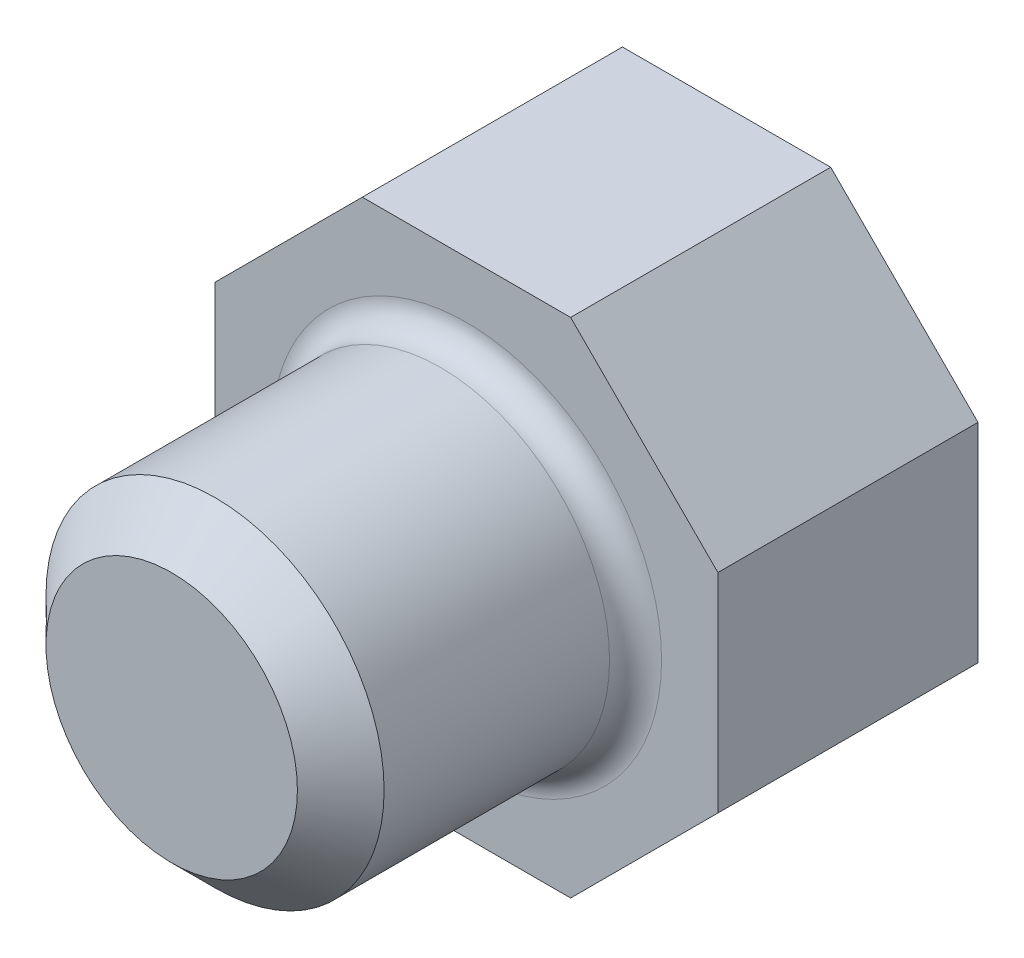
ISO-10303-21;
HEADER;
FILE_DESCRIPTION(('STEP AP214'),'2;1');
FILE_NAME('part.step','',(''),(''),'','','');
FILE_SCHEMA(('AUTOMOTIVE_DESIGN { 1 0 10303 214 1 1 1 1 }'));
ENDSEC;
DATA;
#1=APPLICATION_CONTEXT('core data for automotive mechanical design processes');
#2=APPLICATION_PROTOCOL_DEFINITION('international standard','automotive_design',2000,#1);
#3=PRODUCT_CONTEXT('',#1,'mechanical');
#4=PRODUCT('Part','Part','',(#3));
#5=PRODUCT_RELATED_PRODUCT_CATEGORY('part','',(#4));
#6=PRODUCT_DEFINITION_FORMATION('','',#4);
#7=PRODUCT_DEFINITION_CONTEXT('part definition',#1,'design');
#8=PRODUCT_DEFINITION('design','',#6,#7);
#9=PRODUCT_DEFINITION_SHAPE('','',#8);
#10=(LENGTH_UNIT() NAMED_UNIT(*) SI_UNIT(.MILLI.,.METRE.));
#11=(NAMED_UNIT(*) PLANE_ANGLE_UNIT() SI_UNIT($,.RADIAN.));
#12=(NAMED_UNIT(*) SI_UNIT($,.STERADIAN.) SOLID_ANGLE_UNIT());
#13=UNCERTAINTY_MEASURE_WITH_UNIT(LENGTH_MEASURE(1.E-05),#10,'distance_accuracy_value','');
#14=(GEOMETRIC_REPRESENTATION_CONTEXT(3) GLOBAL_UNCERTAINTY_ASSIGNED_CONTEXT((#13)) GLOBAL_UNIT_ASSIGNED_CONTEXT((#10,
#11,#12)) REPRESENTATION_CONTEXT('',''));
#15=CARTESIAN_POINT('',(0.,0.,0.));
#16=DIRECTION('',(0.,0.,1.));
#17=DIRECTION('',(1.,0.,0.));
#18=AXIS2_PLACEMENT_3D('',#15,#16,#17);
#19=CARTESIAN_POINT('',(5.8,2.40243866176395,6.));
#20=DIRECTION('',(-0.707106781186548,-0.707106781186547,0.));
#21=DIRECTION('',(0.707106781186547,-0.707106781186548,0.));
#22=AXIS2_PLACEMENT_3D('',#19,#20,#21);
#23=PLANE('',#22);
#24=DIRECTION('',(-0.707106781186547,0.707106781186548,0.));
#25=VECTOR('',#24,1.);
#26=CARTESIAN_POINT('',(5.8,2.40243866176395,0.));
#27=LINE('',#26,#25);
#28=CARTESIAN_POINT('',(5.8,2.40243866176395,0.));
#29=VERTEX_POINT('',#28);
#30=CARTESIAN_POINT('',(2.40243866176395,5.8,0.));
#31=VERTEX_POINT('',#30);
#32=EDGE_CURVE('E139',#29,#31,#27,.T.);
#33=ORIENTED_EDGE('',*,*,#32,.T.);
#34=DIRECTION('',(0.,0.,-1.));
#35=VECTOR('',#34,1.);
#36=CARTESIAN_POINT('',(2.40243866176395,5.8,6.));
#37=LINE('',#36,#35);
#38=CARTESIAN_POINT('',(2.40243866176395,5.8,6.));
#39=VERTEX_POINT('',#38);
#40=EDGE_CURVE('E166',#39,#31,#37,.T.);
#41=ORIENTED_EDGE('',*,*,#40,.F.);
#42=DIRECTION('',(-0.707106781186547,0.707106781186548,0.));
#43=VECTOR('',#42,1.);
#44=CARTESIAN_POINT('',(5.8,2.40243866176395,6.));
#45=LINE('',#44,#43);
#46=CARTESIAN_POINT('',(5.8,2.40243866176395,6.));
#47=VERTEX_POINT('',#46);
#48=EDGE_CURVE('E153',#47,#39,#45,.T.);
#49=ORIENTED_EDGE('',*,*,#48,.F.);
#50=DIRECTION('',(0.,0.,-1.));
#51=VECTOR('',#50,1.);
#52=CARTESIAN_POINT('',(5.8,2.40243866176395,6.));
#53=LINE('',#52,#51);
#54=EDGE_CURVE('E135',#47,#29,#53,.T.);
#55=ORIENTED_EDGE('',*,*,#54,.T.);
#56=EDGE_LOOP('',(#33,#41,#49,#55));
#57=FACE_BOUND('',#56,.T.);
#58=ADVANCED_FACE('F41',(#57),#23,.F.);
#59=CARTESIAN_POINT('',(2.40243866176395,5.8,6.));
#60=DIRECTION('',(0.,-1.,0.));
#61=DIRECTION('',(1.,0.,0.));
#62=AXIS2_PLACEMENT_3D('',#59,#60,#61);
#63=PLANE('',#62);
#64=DIRECTION('',(-1.,0.,0.));
#65=VECTOR('',#64,1.);
#66=CARTESIAN_POINT('',(2.40243866176395,5.8,0.));
#67=LINE('',#66,#65);
#68=CARTESIAN_POINT('',(-2.40243866176395,5.8,0.));
#69=VERTEX_POINT('',#68);
#70=EDGE_CURVE('E142',#31,#69,#67,.T.);
#71=ORIENTED_EDGE('',*,*,#70,.T.);
#72=DIRECTION('',(0.,0.,-1.));
#73=VECTOR('',#72,1.);
#74=CARTESIAN_POINT('',(-2.40243866176395,5.8,6.));
#75=LINE('',#74,#73);
#76=CARTESIAN_POINT('',(-2.40243866176395,5.8,6.));
#77=VERTEX_POINT('',#76);
#78=EDGE_CURVE('E163',#77,#69,#75,.T.);
#79=ORIENTED_EDGE('',*,*,#78,.F.);
#80=DIRECTION('',(-1.,0.,0.));
#81=VECTOR('',#80,1.);
#82=CARTESIAN_POINT('',(2.40243866176395,5.8,6.));
#83=LINE('',#82,#81);
#84=EDGE_CURVE('E102',#39,#77,#83,.T.);
#85=ORIENTED_EDGE('',*,*,#84,.F.);
#86=ORIENTED_EDGE('',*,*,#40,.T.);
#87=EDGE_LOOP('',(#71,#79,#85,#86));
#88=FACE_BOUND('',#87,.T.);
#89=ADVANCED_FACE('F190',(#88),#63,.F.);
#90=CARTESIAN_POINT('',(-2.40243866176395,5.8,6.));
#91=DIRECTION('',(0.707106781186547,-0.707106781186548,0.));
#92=DIRECTION('',(0.707106781186548,0.707106781186547,0.));
#93=AXIS2_PLACEMENT_3D('',#90,#91,#92);
#94=PLANE('',#93);
#95=DIRECTION('',(-0.707106781186547,-0.707106781186547,0.));
#96=VECTOR('',#95,1.);
#97=CARTESIAN_POINT('',(-2.40243866176395,5.8,0.));
#98=LINE('',#97,#96);
#99=CARTESIAN_POINT('',(-5.8,2.40243866176395,0.));
#100=VERTEX_POINT('',#99);
#101=EDGE_CURVE('E144',#69,#100,#98,.T.);
#102=ORIENTED_EDGE('',*,*,#101,.T.);
#103=DIRECTION('',(0.,0.,-1.));
#104=VECTOR('',#103,1.);
#105=CARTESIAN_POINT('',(-5.8,2.40243866176395,6.));
#106=LINE('',#105,#104);
#107=CARTESIAN_POINT('',(-5.8,2.40243866176395,6.));
#108=VERTEX_POINT('',#107);
#109=EDGE_CURVE('E160',#108,#100,#106,.T.);
#110=ORIENTED_EDGE('',*,*,#109,.F.);
#111=DIRECTION('',(-0.707106781186547,-0.707106781186547,0.));
#112=VECTOR('',#111,1.);
#113=CARTESIAN_POINT('',(-2.40243866176395,5.8,6.));
#114=LINE('',#113,#112);
#115=EDGE_CURVE('E317',#77,#108,#114,.T.);
#116=ORIENTED_EDGE('',*,*,#115,.F.);
#117=ORIENTED_EDGE('',*,*,#78,.T.);
#118=EDGE_LOOP('',(#102,#110,#116,#117));
#119=FACE_BOUND('',#118,.T.);
#120=ADVANCED_FACE('F196',(#119),#94,.F.);
#121=CARTESIAN_POINT('',(-5.8,2.40243866176395,6.));
#122=DIRECTION('',(1.,0.,0.));
#123=DIRECTION('',(0.,1.,0.));
#124=AXIS2_PLACEMENT_3D('',#121,#122,#123);
#125=PLANE('',#124);
#126=DIRECTION('',(0.,-1.,0.));
#127=VECTOR('',#126,1.);
#128=CARTESIAN_POINT('',(-5.8,2.40243866176395,0.));
#129=LINE('',#128,#127);
#130=CARTESIAN_POINT('',(-5.8,-2.40243866176395,0.));
#131=VERTEX_POINT('',#130);
#132=EDGE_CURVE('E146',#100,#131,#129,.T.);
#133=ORIENTED_EDGE('',*,*,#132,.T.);
#134=DIRECTION('',(0.,0.,-1.));
#135=VECTOR('',#134,1.);
#136=CARTESIAN_POINT('',(-5.8,-2.40243866176395,6.));
#137=LINE('',#136,#135);
#138=CARTESIAN_POINT('',(-5.8,-2.40243866176395,6.));
#139=VERTEX_POINT('',#138);
#140=EDGE_CURVE('E157',#139,#131,#137,.T.);
#141=ORIENTED_EDGE('',*,*,#140,.F.);
#142=DIRECTION('',(0.,-1.,0.));
#143=VECTOR('',#142,1.);
#144=CARTESIAN_POINT('',(-5.8,2.40243866176395,6.));
#145=LINE('',#144,#143);
#146=EDGE_CURVE('E321',#108,#139,#145,.T.);
#147=ORIENTED_EDGE('',*,*,#146,.F.);
#148=ORIENTED_EDGE('',*,*,#109,.T.);
#149=EDGE_LOOP('',(#133,#141,#147,#148));
#150=FACE_BOUND('',#149,.T.);
#151=ADVANCED_FACE('F204',(#150),#125,.F.);
#152=CARTESIAN_POINT('',(-5.8,-2.40243866176395,6.));
#153=DIRECTION('',(0.707106781186548,0.707106781186547,0.));
#154=DIRECTION('',(-0.707106781186547,0.707106781186548,0.));
#155=AXIS2_PLACEMENT_3D('',#152,#153,#154);
#156=PLANE('',#155);
#157=DIRECTION('',(0.707106781186547,-0.707106781186548,0.));
#158=VECTOR('',#157,1.);
#159=CARTESIAN_POINT('',(-5.8,-2.40243866176395,0.));
#160=LINE('',#159,#158);
#161=CARTESIAN_POINT('',(-2.40243866176395,-5.8,0.));
#162=VERTEX_POINT('',#161);
#163=EDGE_CURVE('E148',#131,#162,#160,.T.);
#164=ORIENTED_EDGE('',*,*,#163,.T.);
#165=DIRECTION('',(0.,0.,-1.));
#166=VECTOR('',#165,1.);
#167=CARTESIAN_POINT('',(-2.40243866176395,-5.8,6.));
#168=LINE('',#167,#166);
#169=CARTESIAN_POINT('',(-2.40243866176395,-5.8,6.));
#170=VERTEX_POINT('',#169);
#171=EDGE_CURVE('E130',#170,#162,#168,.T.);
#172=ORIENTED_EDGE('',*,*,#171,.F.);
#173=DIRECTION('',(0.707106781186547,-0.707106781186548,0.));
#174=VECTOR('',#173,1.);
#175=CARTESIAN_POINT('',(-5.8,-2.40243866176395,6.));
#176=LINE('',#175,#174);
#177=EDGE_CURVE('E121',#139,#170,#176,.T.);
#178=ORIENTED_EDGE('',*,*,#177,.F.);
#179=ORIENTED_EDGE('',*,*,#140,.T.);
#180=EDGE_LOOP('',(#164,#172,#178,#179));
#181=FACE_BOUND('',#180,.T.);
#182=ADVANCED_FACE('F208',(#181),#156,.F.);
#183=CARTESIAN_POINT('',(-2.40243866176395,-5.8,6.));
#184=DIRECTION('',(0.,1.,0.));
#185=DIRECTION('',(-1.,0.,0.));
#186=AXIS2_PLACEMENT_3D('',#183,#184,#185);
#187=PLANE('',#186);
#188=DIRECTION('',(1.,0.,0.));
#189=VECTOR('',#188,1.);
#190=CARTESIAN_POINT('',(-2.40243866176395,-5.8,0.));
#191=LINE('',#190,#189);
#192=CARTESIAN_POINT('',(2.40243866176395,-5.8,0.));
#193=VERTEX_POINT('',#192);
#194=EDGE_CURVE('E129',#162,#193,#191,.T.);
#195=ORIENTED_EDGE('',*,*,#194,.T.);
#196=DIRECTION('',(0.,0.,-1.));
#197=VECTOR('',#196,1.);
#198=CARTESIAN_POINT('',(2.40243866176395,-5.8,6.));
#199=LINE('',#198,#197);
#200=CARTESIAN_POINT('',(2.40243866176395,-5.8,6.));
#201=VERTEX_POINT('',#200);
#202=EDGE_CURVE('E126',#201,#193,#199,.T.);
#203=ORIENTED_EDGE('',*,*,#202,.F.);
#204=DIRECTION('',(1.,0.,0.));
#205=VECTOR('',#204,1.);
#206=CARTESIAN_POINT('',(-2.40243866176395,-5.8,6.));
#207=LINE('',#206,#205);
#208=EDGE_CURVE('E115',#170,#201,#207,.T.);
#209=ORIENTED_EDGE('',*,*,#208,.F.);
#210=ORIENTED_EDGE('',*,*,#171,.T.);
#211=EDGE_LOOP('',(#195,#203,#209,#210));
#212=FACE_BOUND('',#211,.T.);
#213=ADVANCED_FACE('F127',(#212),#187,.F.);
#214=CARTESIAN_POINT('',(2.40243866176395,-5.8,6.));
#215=DIRECTION('',(-0.707106781186548,0.707106781186547,0.));
#216=DIRECTION('',(-0.707106781186547,-0.707106781186548,0.));
#217=AXIS2_PLACEMENT_3D('',#214,#215,#216);
#218=PLANE('',#217);
#219=DIRECTION('',(0.707106781186547,0.707106781186548,0.));
#220=VECTOR('',#219,1.);
#221=CARTESIAN_POINT('',(2.40243866176395,-5.8,0.));
#222=LINE('',#221,#220);
#223=CARTESIAN_POINT('',(5.8,-2.40243866176395,0.));
#224=VERTEX_POINT('',#223);
#225=EDGE_CURVE('E87',#193,#224,#222,.T.);
#226=ORIENTED_EDGE('',*,*,#225,.T.);
#227=DIRECTION('',(0.,0.,-1.));
#228=VECTOR('',#227,1.);
#229=CARTESIAN_POINT('',(5.8,-2.40243866176395,6.));
#230=LINE('',#229,#228);
#231=CARTESIAN_POINT('',(5.8,-2.40243866176395,6.));
#232=VERTEX_POINT('',#231);
#233=EDGE_CURVE('E131',#232,#224,#230,.T.);
#234=ORIENTED_EDGE('',*,*,#233,.F.);
#235=DIRECTION('',(0.707106781186547,0.707106781186548,0.));
#236=VECTOR('',#235,1.);
#237=CARTESIAN_POINT('',(2.40243866176395,-5.8,6.));
#238=LINE('',#237,#236);
#239=EDGE_CURVE('E119',#201,#232,#238,.T.);
#240=ORIENTED_EDGE('',*,*,#239,.F.);
#241=ORIENTED_EDGE('',*,*,#202,.T.);
#242=EDGE_LOOP('',(#226,#234,#240,#241));
#243=FACE_BOUND('',#242,.T.);
#244=ADVANCED_FACE('F133',(#243),#218,.F.);
#245=CARTESIAN_POINT('',(5.8,-2.40243866176395,6.));
#246=DIRECTION('',(-1.,0.,0.));
#247=DIRECTION('',(0.,0.,1.));
#248=AXIS2_PLACEMENT_3D('',#245,#246,#247);
#249=PLANE('',#248);
#250=DIRECTION('',(0.,1.,0.));
#251=VECTOR('',#250,1.);
#252=CARTESIAN_POINT('',(5.8,-2.40243866176395,0.));
#253=LINE('',#252,#251);
#254=EDGE_CURVE('E93',#224,#29,#253,.T.);
#255=ORIENTED_EDGE('',*,*,#254,.T.);
#256=ORIENTED_EDGE('',*,*,#54,.F.);
#257=DIRECTION('',(0.,1.,0.));
#258=VECTOR('',#257,1.);
#259=CARTESIAN_POINT('',(5.8,-2.40243866176395,6.));
#260=LINE('',#259,#258);
#261=EDGE_CURVE('E58',#232,#47,#260,.T.);
#262=ORIENTED_EDGE('',*,*,#261,.F.);
#263=ORIENTED_EDGE('',*,*,#233,.T.);
#264=EDGE_LOOP('',(#255,#256,#262,#263));
#265=FACE_BOUND('',#264,.T.);
#266=ADVANCED_FACE('F217',(#265),#249,.F.);
#267=CARTESIAN_POINT('',(0.,0.,6.));
#268=DIRECTION('',(0.,0.,1.));
#269=DIRECTION('',(1.,0.,0.));
#270=AXIS2_PLACEMENT_3D('',#267,#268,#269);
#271=PLANE('',#270);
#272=CARTESIAN_POINT('',(0.,0.,6.));
#273=DIRECTION('',(0.,0.,1.));
#274=DIRECTION('',(1.,0.,0.));
#275=AXIS2_PLACEMENT_3D('',#272,#273,#274);
#276=CIRCLE('',#275,4.5);
#277=CARTESIAN_POINT('',(4.5,0.,6.));
#278=VERTEX_POINT('',#277);
#279=EDGE_CURVE('E11',#278,#278,#276,.F.);
#280=ORIENTED_EDGE('',*,*,#279,.T.);
#281=EDGE_LOOP('',(#280));
#282=FACE_BOUND('',#281,.T.);
#283=ORIENTED_EDGE('',*,*,#48,.T.);
#284=ORIENTED_EDGE('',*,*,#84,.T.);
#285=ORIENTED_EDGE('',*,*,#115,.T.);
#286=ORIENTED_EDGE('',*,*,#146,.T.);
#287=ORIENTED_EDGE('',*,*,#177,.T.);
#288=ORIENTED_EDGE('',*,*,#208,.T.);
#289=ORIENTED_EDGE('',*,*,#239,.T.);
#290=ORIENTED_EDGE('',*,*,#261,.T.);
#291=EDGE_LOOP('',(#283,#284,#285,#286,#287,#288,#289,#290));
#292=FACE_BOUND('',#291,.T.);
#293=ADVANCED_FACE('F117',(#282,#292),#271,.T.);
#294=CARTESIAN_POINT('',(0.,0.,0.));
#295=DIRECTION('',(0.,0.,1.));
#296=DIRECTION('',(1.,0.,0.));
#297=AXIS2_PLACEMENT_3D('',#294,#295,#296);
#298=PLANE('',#297);
#299=ORIENTED_EDGE('',*,*,#32,.F.);
#300=ORIENTED_EDGE('',*,*,#254,.F.);
#301=ORIENTED_EDGE('',*,*,#225,.F.);
#302=ORIENTED_EDGE('',*,*,#194,.F.);
#303=ORIENTED_EDGE('',*,*,#163,.F.);
#304=ORIENTED_EDGE('',*,*,#132,.F.);
#305=ORIENTED_EDGE('',*,*,#101,.F.);
#306=ORIENTED_EDGE('',*,*,#70,.F.);
#307=EDGE_LOOP('',(#299,#300,#301,#302,#303,#304,#305,#306));
#308=FACE_BOUND('',#307,.T.);
#309=ADVANCED_FACE('F220',(#308),#298,.F.);
#310=CARTESIAN_POINT('',(0.,0.,12.8));
#311=DIRECTION('',(0.,0.,-1.));
#312=DIRECTION('',(-1.,0.,0.));
#313=AXIS2_PLACEMENT_3D('',#310,#311,#312);
#314=CYLINDRICAL_SURFACE('',#313,3.9);
#315=CARTESIAN_POINT('',(0.,0.,6.6));
#316=DIRECTION('',(0.,0.,1.));
#317=DIRECTION('',(1.,0.,0.));
#318=AXIS2_PLACEMENT_3D('',#315,#316,#317);
#319=CIRCLE('',#318,3.9);
#320=CARTESIAN_POINT('',(3.9,0.,6.6));
#321=VERTEX_POINT('',#320);
#322=EDGE_CURVE('E50',#321,#321,#319,.T.);
#323=ORIENTED_EDGE('',*,*,#322,.T.);
#324=EDGE_LOOP('',(#323));
#325=FACE_BOUND('',#324,.T.);
#326=CARTESIAN_POINT('',(0.,0.,11.8));
#327=DIRECTION('',(0.,0.,1.));
#328=DIRECTION('',(1.,0.,0.));
#329=AXIS2_PLACEMENT_3D('',#326,#327,#328);
#330=CIRCLE('',#329,3.9);
#331=CARTESIAN_POINT('',(3.9,0.,11.8));
#332=VERTEX_POINT('',#331);
#333=EDGE_CURVE('E171',#332,#332,#330,.F.);
#334=ORIENTED_EDGE('',*,*,#333,.T.);
#335=EDGE_LOOP('',(#334));
#336=FACE_BOUND('',#335,.T.);
#337=ADVANCED_FACE('F176',(#325,#336),#314,.T.);
#338=CARTESIAN_POINT('',(0.,0.,12.8));
#339=DIRECTION('',(0.,0.,1.));
#340=DIRECTION('',(1.,0.,0.));
#341=AXIS2_PLACEMENT_3D('',#338,#339,#340);
#342=PLANE('',#341);
#343=CARTESIAN_POINT('',(0.,0.,12.8));
#344=DIRECTION('',(0.,0.,1.));
#345=DIRECTION('',(1.,0.,0.));
#346=AXIS2_PLACEMENT_3D('',#343,#344,#345);
#347=CIRCLE('',#346,2.9);
#348=CARTESIAN_POINT('',(2.9,0.,12.8));
#349=VERTEX_POINT('',#348);
#350=EDGE_CURVE('E168',#349,#349,#347,.T.);
#351=ORIENTED_EDGE('',*,*,#350,.T.);
#352=EDGE_LOOP('',(#351));
#353=FACE_BOUND('',#352,.T.);
#354=ADVANCED_FACE('F186',(#353),#342,.T.);
#355=CARTESIAN_POINT('',(0.,0.,12.8));
#356=DIRECTION('',(0.,0.,-1.));
#357=DIRECTION('',(-1.,0.,0.));
#358=AXIS2_PLACEMENT_3D('',#355,#356,#357);
#359=CONICAL_SURFACE('',#358,2.9,0.785398163397445);
#360=ORIENTED_EDGE('',*,*,#333,.F.);
#361=EDGE_LOOP('',(#360));
#362=FACE_BOUND('',#361,.T.);
#363=ORIENTED_EDGE('',*,*,#350,.F.);
#364=EDGE_LOOP('',(#363));
#365=FACE_BOUND('',#364,.T.);
#366=ADVANCED_FACE('F180',(#362,#365),#359,.T.);
#367=CARTESIAN_POINT('',(0.,0.,6.6));
#368=DIRECTION('',(0.,0.,1.));
#369=DIRECTION('',(1.,0.,0.));
#370=AXIS2_PLACEMENT_3D('',#367,#368,#369);
#371=TOROIDAL_SURFACE('',#370,4.5,0.6);
#372=ORIENTED_EDGE('',*,*,#279,.F.);
#373=EDGE_LOOP('',(#372));
#374=FACE_BOUND('',#373,.T.);
#375=ORIENTED_EDGE('',*,*,#322,.F.);
#376=EDGE_LOOP('',(#375));
#377=FACE_BOUND('',#376,.T.);
#378=ADVANCED_FACE('F43',(#374,#377),#371,.F.);
#379=CLOSED_SHELL('',(#58,#89,#120,#151,#182,#213,#244,#266,#293,#309,#337,#354,#366,#378));
#380=MANIFOLD_SOLID_BREP('B2',#379);
#381=ADVANCED_BREP_SHAPE_REPRESENTATION('',(#18,#380),#14);
#382=SHAPE_DEFINITION_REPRESENTATION(#9,#381);
ENDSEC;
END-ISO-10303-21;
